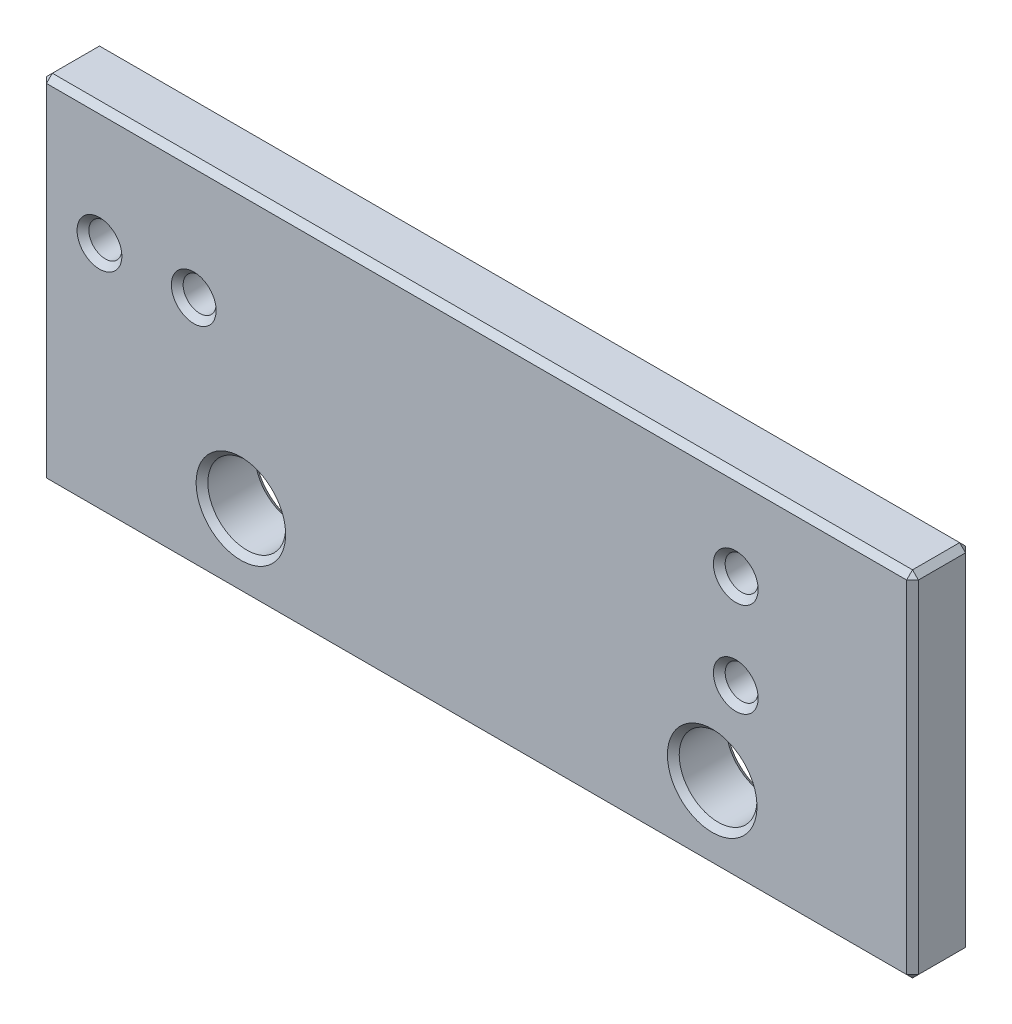
ISO-10303-21;
HEADER;
FILE_DESCRIPTION(('STEP AP214'),'2;1');
FILE_NAME('part.step','',(''),(''),'','','');
FILE_SCHEMA(('AUTOMOTIVE_DESIGN { 1 0 10303 214 1 1 1 1 }'));
ENDSEC;
DATA;
#1=APPLICATION_CONTEXT('core data for automotive mechanical design processes');
#2=APPLICATION_PROTOCOL_DEFINITION('international standard','automotive_design',2000,#1);
#3=PRODUCT_CONTEXT('',#1,'mechanical');
#4=PRODUCT('Part','Part','',(#3));
#5=PRODUCT_RELATED_PRODUCT_CATEGORY('part','',(#4));
#6=PRODUCT_DEFINITION_FORMATION('','',#4);
#7=PRODUCT_DEFINITION_CONTEXT('part definition',#1,'design');
#8=PRODUCT_DEFINITION('design','',#6,#7);
#9=PRODUCT_DEFINITION_SHAPE('','',#8);
#10=(LENGTH_UNIT() NAMED_UNIT(*) SI_UNIT(.MILLI.,.METRE.));
#11=(NAMED_UNIT(*) PLANE_ANGLE_UNIT() SI_UNIT($,.RADIAN.));
#12=(NAMED_UNIT(*) SI_UNIT($,.STERADIAN.) SOLID_ANGLE_UNIT());
#13=UNCERTAINTY_MEASURE_WITH_UNIT(LENGTH_MEASURE(1.E-05),#10,'distance_accuracy_value','');
#14=(GEOMETRIC_REPRESENTATION_CONTEXT(3) GLOBAL_UNCERTAINTY_ASSIGNED_CONTEXT((#13)) GLOBAL_UNIT_ASSIGNED_CONTEXT((#10,
#11,#12)) REPRESENTATION_CONTEXT('',''));
#15=CARTESIAN_POINT('',(0.,0.,0.));
#16=DIRECTION('',(0.,0.,1.));
#17=DIRECTION('',(1.,0.,0.));
#18=AXIS2_PLACEMENT_3D('',#15,#16,#17);
#19=CARTESIAN_POINT('',(0.,0.,5.));
#20=DIRECTION('',(1.,0.,0.));
#21=DIRECTION('',(0.,0.,-1.));
#22=AXIS2_PLACEMENT_3D('',#19,#20,#21);
#23=PLANE('',#22);
#24=DIRECTION('',(0.,0.,-1.));
#25=VECTOR('',#24,1.);
#26=CARTESIAN_POINT('',(0.,29.5,5.));
#27=LINE('',#26,#25);
#28=CARTESIAN_POINT('',(0.,29.5,4.5));
#29=VERTEX_POINT('',#28);
#30=CARTESIAN_POINT('',(0.,29.5,0.5));
#31=VERTEX_POINT('',#30);
#32=EDGE_CURVE('E42',#29,#31,#27,.T.);
#33=ORIENTED_EDGE('',*,*,#32,.T.);
#34=DIRECTION('',(0.,-1.,0.));
#35=VECTOR('',#34,1.);
#36=CARTESIAN_POINT('',(0.,0.,0.5));
#37=LINE('',#36,#35);
#38=CARTESIAN_POINT('',(0.,0.5,0.5));
#39=VERTEX_POINT('',#38);
#40=EDGE_CURVE('E11',#31,#39,#37,.T.);
#41=ORIENTED_EDGE('',*,*,#40,.T.);
#42=DIRECTION('',(0.,0.,1.));
#43=VECTOR('',#42,1.);
#44=CARTESIAN_POINT('',(0.,0.5,5.));
#45=LINE('',#44,#43);
#46=CARTESIAN_POINT('',(0.,0.5,4.5));
#47=VERTEX_POINT('',#46);
#48=EDGE_CURVE('E269',#39,#47,#45,.T.);
#49=ORIENTED_EDGE('',*,*,#48,.T.);
#50=DIRECTION('',(0.,1.,0.));
#51=VECTOR('',#50,1.);
#52=CARTESIAN_POINT('',(0.,0.,4.5));
#53=LINE('',#52,#51);
#54=EDGE_CURVE('E53',#47,#29,#53,.T.);
#55=ORIENTED_EDGE('',*,*,#54,.T.);
#56=EDGE_LOOP('',(#33,#41,#49,#55));
#57=FACE_BOUND('',#56,.T.);
#58=ADVANCED_FACE('F33',(#57),#23,.F.);
#59=CARTESIAN_POINT('',(0.,0.,5.));
#60=DIRECTION('',(0.,1.,0.));
#61=DIRECTION('',(0.,0.,1.));
#62=AXIS2_PLACEMENT_3D('',#59,#60,#61);
#63=PLANE('',#62);
#64=DIRECTION('',(0.,0.,-1.));
#65=VECTOR('',#64,1.);
#66=CARTESIAN_POINT('',(0.5,0.,5.));
#67=LINE('',#66,#65);
#68=CARTESIAN_POINT('',(0.5,0.,4.5));
#69=VERTEX_POINT('',#68);
#70=CARTESIAN_POINT('',(0.5,0.,0.5));
#71=VERTEX_POINT('',#70);
#72=EDGE_CURVE('E244',#69,#71,#67,.T.);
#73=ORIENTED_EDGE('',*,*,#72,.T.);
#74=DIRECTION('',(1.,0.,0.));
#75=VECTOR('',#74,1.);
#76=CARTESIAN_POINT('',(74.,0.,0.5));
#77=LINE('',#76,#75);
#78=CARTESIAN_POINT('',(73.5,0.,0.5));
#79=VERTEX_POINT('',#78);
#80=EDGE_CURVE('E130',#71,#79,#77,.T.);
#81=ORIENTED_EDGE('',*,*,#80,.T.);
#82=DIRECTION('',(0.,0.,1.));
#83=VECTOR('',#82,1.);
#84=CARTESIAN_POINT('',(73.5,0.,5.));
#85=LINE('',#84,#83);
#86=CARTESIAN_POINT('',(73.5,0.,4.5));
#87=VERTEX_POINT('',#86);
#88=EDGE_CURVE('E248',#79,#87,#85,.T.);
#89=ORIENTED_EDGE('',*,*,#88,.T.);
#90=DIRECTION('',(-1.,0.,0.));
#91=VECTOR('',#90,1.);
#92=CARTESIAN_POINT('',(0.,0.,4.5));
#93=LINE('',#92,#91);
#94=EDGE_CURVE('E246',#87,#69,#93,.T.);
#95=ORIENTED_EDGE('',*,*,#94,.T.);
#96=EDGE_LOOP('',(#73,#81,#89,#95));
#97=FACE_BOUND('',#96,.T.);
#98=ADVANCED_FACE('F353',(#97),#63,.F.);
#99=CARTESIAN_POINT('',(74.,0.,5.));
#100=DIRECTION('',(-1.,0.,0.));
#101=DIRECTION('',(0.,0.,1.));
#102=AXIS2_PLACEMENT_3D('',#99,#100,#101);
#103=PLANE('',#102);
#104=DIRECTION('',(0.,0.,-1.));
#105=VECTOR('',#104,1.);
#106=CARTESIAN_POINT('',(74.,0.5,5.));
#107=LINE('',#106,#105);
#108=CARTESIAN_POINT('',(74.,0.5,4.5));
#109=VERTEX_POINT('',#108);
#110=CARTESIAN_POINT('',(74.,0.5,0.5));
#111=VERTEX_POINT('',#110);
#112=EDGE_CURVE('E251',#109,#111,#107,.T.);
#113=ORIENTED_EDGE('',*,*,#112,.T.);
#114=DIRECTION('',(0.,1.,0.));
#115=VECTOR('',#114,1.);
#116=CARTESIAN_POINT('',(74.,30.,0.5));
#117=LINE('',#116,#115);
#118=CARTESIAN_POINT('',(74.,29.5,0.5));
#119=VERTEX_POINT('',#118);
#120=EDGE_CURVE('E257',#111,#119,#117,.T.);
#121=ORIENTED_EDGE('',*,*,#120,.T.);
#122=DIRECTION('',(0.,0.,1.));
#123=VECTOR('',#122,1.);
#124=CARTESIAN_POINT('',(74.,29.5,5.));
#125=LINE('',#124,#123);
#126=CARTESIAN_POINT('',(74.,29.5,4.5));
#127=VERTEX_POINT('',#126);
#128=EDGE_CURVE('E255',#119,#127,#125,.T.);
#129=ORIENTED_EDGE('',*,*,#128,.T.);
#130=DIRECTION('',(0.,-1.,0.));
#131=VECTOR('',#130,1.);
#132=CARTESIAN_POINT('',(74.,0.,4.5));
#133=LINE('',#132,#131);
#134=EDGE_CURVE('E253',#127,#109,#133,.T.);
#135=ORIENTED_EDGE('',*,*,#134,.T.);
#136=EDGE_LOOP('',(#113,#121,#129,#135));
#137=FACE_BOUND('',#136,.T.);
#138=ADVANCED_FACE('F407',(#137),#103,.F.);
#139=CARTESIAN_POINT('',(0.,30.,5.));
#140=DIRECTION('',(0.,-1.,0.));
#141=DIRECTION('',(0.,0.,-1.));
#142=AXIS2_PLACEMENT_3D('',#139,#140,#141);
#143=PLANE('',#142);
#144=DIRECTION('',(1.,0.,0.));
#145=VECTOR('',#144,1.);
#146=CARTESIAN_POINT('',(0.,30.,4.5));
#147=LINE('',#146,#145);
#148=CARTESIAN_POINT('',(0.5,30.,4.5));
#149=VERTEX_POINT('',#148);
#150=CARTESIAN_POINT('',(73.5,30.,4.5));
#151=VERTEX_POINT('',#150);
#152=EDGE_CURVE('E262',#149,#151,#147,.T.);
#153=ORIENTED_EDGE('',*,*,#152,.T.);
#154=DIRECTION('',(0.,0.,-1.));
#155=VECTOR('',#154,1.);
#156=CARTESIAN_POINT('',(73.5,30.,5.));
#157=LINE('',#156,#155);
#158=CARTESIAN_POINT('',(73.5,30.,0.5));
#159=VERTEX_POINT('',#158);
#160=EDGE_CURVE('E267',#151,#159,#157,.T.);
#161=ORIENTED_EDGE('',*,*,#160,.T.);
#162=DIRECTION('',(-1.,0.,0.));
#163=VECTOR('',#162,1.);
#164=CARTESIAN_POINT('',(0.,30.,0.5));
#165=LINE('',#164,#163);
#166=CARTESIAN_POINT('',(0.5,30.,0.5));
#167=VERTEX_POINT('',#166);
#168=EDGE_CURVE('E264',#159,#167,#165,.T.);
#169=ORIENTED_EDGE('',*,*,#168,.T.);
#170=DIRECTION('',(0.,0.,1.));
#171=VECTOR('',#170,1.);
#172=CARTESIAN_POINT('',(0.5,30.,5.));
#173=LINE('',#172,#171);
#174=EDGE_CURVE('E260',#167,#149,#173,.T.);
#175=ORIENTED_EDGE('',*,*,#174,.T.);
#176=EDGE_LOOP('',(#153,#161,#169,#175));
#177=FACE_BOUND('',#176,.T.);
#178=ADVANCED_FACE('F376',(#177),#143,.F.);
#179=CARTESIAN_POINT('',(0.,0.,5.));
#180=DIRECTION('',(0.,0.,-1.));
#181=DIRECTION('',(-1.,0.,0.));
#182=AXIS2_PLACEMENT_3D('',#179,#180,#181);
#183=PLANE('',#182);
#184=CARTESIAN_POINT('',(57.,6.5,5.));
#185=DIRECTION('',(0.,0.,-1.));
#186=DIRECTION('',(-1.,0.,0.));
#187=AXIS2_PLACEMENT_3D('',#184,#185,#186);
#188=CIRCLE('',#187,3.79999999999999);
#189=CARTESIAN_POINT('',(53.2,6.5,5.));
#190=VERTEX_POINT('',#189);
#191=EDGE_CURVE('E241',#190,#190,#188,.T.);
#192=ORIENTED_EDGE('',*,*,#191,.T.);
#193=EDGE_LOOP('',(#192));
#194=FACE_BOUND('',#193,.T.);
#195=CARTESIAN_POINT('',(17.,6.5,5.));
#196=DIRECTION('',(0.,0.,-1.));
#197=DIRECTION('',(-1.,0.,0.));
#198=AXIS2_PLACEMENT_3D('',#195,#196,#197);
#199=CIRCLE('',#198,3.79999999999999);
#200=CARTESIAN_POINT('',(13.2,6.5,5.));
#201=VERTEX_POINT('',#200);
#202=EDGE_CURVE('E238',#201,#201,#199,.T.);
#203=ORIENTED_EDGE('',*,*,#202,.T.);
#204=EDGE_LOOP('',(#203));
#205=FACE_BOUND('',#204,.T.);
#206=CARTESIAN_POINT('',(59.,14.5,5.));
#207=DIRECTION('',(0.,0.,-1.));
#208=DIRECTION('',(-1.,0.,0.));
#209=AXIS2_PLACEMENT_3D('',#206,#207,#208);
#210=CIRCLE('',#209,1.89999999999999);
#211=CARTESIAN_POINT('',(57.1,14.5,5.));
#212=VERTEX_POINT('',#211);
#213=EDGE_CURVE('E235',#212,#212,#210,.T.);
#214=ORIENTED_EDGE('',*,*,#213,.T.);
#215=EDGE_LOOP('',(#214));
#216=FACE_BOUND('',#215,.T.);
#217=CARTESIAN_POINT('',(59.,22.5,5.));
#218=DIRECTION('',(0.,0.,-1.));
#219=DIRECTION('',(-1.,0.,0.));
#220=AXIS2_PLACEMENT_3D('',#217,#218,#219);
#221=CIRCLE('',#220,1.89999999999999);
#222=CARTESIAN_POINT('',(57.1,22.5,5.));
#223=VERTEX_POINT('',#222);
#224=EDGE_CURVE('E232',#223,#223,#221,.T.);
#225=ORIENTED_EDGE('',*,*,#224,.T.);
#226=EDGE_LOOP('',(#225));
#227=FACE_BOUND('',#226,.T.);
#228=CARTESIAN_POINT('',(13.,20.,5.));
#229=DIRECTION('',(0.,0.,-1.));
#230=DIRECTION('',(-1.,0.,0.));
#231=AXIS2_PLACEMENT_3D('',#228,#229,#230);
#232=CIRCLE('',#231,1.89999999999999);
#233=CARTESIAN_POINT('',(11.1,20.,5.));
#234=VERTEX_POINT('',#233);
#235=EDGE_CURVE('E229',#234,#234,#232,.T.);
#236=ORIENTED_EDGE('',*,*,#235,.T.);
#237=EDGE_LOOP('',(#236));
#238=FACE_BOUND('',#237,.T.);
#239=CARTESIAN_POINT('',(5.,20.,5.));
#240=DIRECTION('',(0.,0.,-1.));
#241=DIRECTION('',(-1.,0.,0.));
#242=AXIS2_PLACEMENT_3D('',#239,#240,#241);
#243=CIRCLE('',#242,1.89999999999999);
#244=CARTESIAN_POINT('',(3.10000000000001,20.,5.));
#245=VERTEX_POINT('',#244);
#246=EDGE_CURVE('E226',#245,#245,#243,.T.);
#247=ORIENTED_EDGE('',*,*,#246,.T.);
#248=EDGE_LOOP('',(#247));
#249=FACE_BOUND('',#248,.T.);
#250=DIRECTION('',(0.,1.,0.));
#251=VECTOR('',#250,1.);
#252=CARTESIAN_POINT('',(73.5,0.,5.));
#253=LINE('',#252,#251);
#254=CARTESIAN_POINT('',(73.5,0.5,5.));
#255=VERTEX_POINT('',#254);
#256=CARTESIAN_POINT('',(73.5,29.5,5.));
#257=VERTEX_POINT('',#256);
#258=EDGE_CURVE('E221',#255,#257,#253,.T.);
#259=ORIENTED_EDGE('',*,*,#258,.T.);
#260=DIRECTION('',(-1.,0.,0.));
#261=VECTOR('',#260,1.);
#262=CARTESIAN_POINT('',(0.,29.5,5.));
#263=LINE('',#262,#261);
#264=CARTESIAN_POINT('',(0.5,29.5,5.));
#265=VERTEX_POINT('',#264);
#266=EDGE_CURVE('E223',#257,#265,#263,.T.);
#267=ORIENTED_EDGE('',*,*,#266,.T.);
#268=DIRECTION('',(0.,-1.,0.));
#269=VECTOR('',#268,1.);
#270=CARTESIAN_POINT('',(0.5,0.,5.));
#271=LINE('',#270,#269);
#272=CARTESIAN_POINT('',(0.5,0.5,5.));
#273=VERTEX_POINT('',#272);
#274=EDGE_CURVE('E217',#265,#273,#271,.T.);
#275=ORIENTED_EDGE('',*,*,#274,.T.);
#276=DIRECTION('',(1.,0.,0.));
#277=VECTOR('',#276,1.);
#278=CARTESIAN_POINT('',(0.,0.5,5.));
#279=LINE('',#278,#277);
#280=EDGE_CURVE('E219',#273,#255,#279,.T.);
#281=ORIENTED_EDGE('',*,*,#280,.T.);
#282=EDGE_LOOP('',(#259,#267,#275,#281));
#283=FACE_BOUND('',#282,.T.);
#284=ADVANCED_FACE('F362',(#194,#205,#216,#227,#238,#249,#283),#183,.F.);
#285=CARTESIAN_POINT('',(0.,0.,0.));
#286=DIRECTION('',(0.,0.,-1.));
#287=DIRECTION('',(-1.,0.,0.));
#288=AXIS2_PLACEMENT_3D('',#285,#286,#287);
#289=PLANE('',#288);
#290=CARTESIAN_POINT('',(57.,6.5,0.));
#291=DIRECTION('',(0.,0.,-1.));
#292=DIRECTION('',(-1.,0.,0.));
#293=AXIS2_PLACEMENT_3D('',#290,#291,#292);
#294=CIRCLE('',#293,3.79999999999998);
#295=CARTESIAN_POINT('',(53.2,6.5,0.));
#296=VERTEX_POINT('',#295);
#297=EDGE_CURVE('E178',#296,#296,#294,.F.);
#298=ORIENTED_EDGE('',*,*,#297,.T.);
#299=EDGE_LOOP('',(#298));
#300=FACE_BOUND('',#299,.T.);
#301=CARTESIAN_POINT('',(17.,6.5,0.));
#302=DIRECTION('',(0.,0.,-1.));
#303=DIRECTION('',(-1.,0.,0.));
#304=AXIS2_PLACEMENT_3D('',#301,#302,#303);
#305=CIRCLE('',#304,3.8);
#306=CARTESIAN_POINT('',(13.2,6.5,0.));
#307=VERTEX_POINT('',#306);
#308=EDGE_CURVE('E175',#307,#307,#305,.F.);
#309=ORIENTED_EDGE('',*,*,#308,.T.);
#310=EDGE_LOOP('',(#309));
#311=FACE_BOUND('',#310,.T.);
#312=CARTESIAN_POINT('',(59.,14.5,0.));
#313=DIRECTION('',(0.,0.,-1.));
#314=DIRECTION('',(-1.,0.,0.));
#315=AXIS2_PLACEMENT_3D('',#312,#313,#314);
#316=CIRCLE('',#315,1.90000000000002);
#317=CARTESIAN_POINT('',(57.1,14.5,0.));
#318=VERTEX_POINT('',#317);
#319=EDGE_CURVE('E172',#318,#318,#316,.F.);
#320=ORIENTED_EDGE('',*,*,#319,.T.);
#321=EDGE_LOOP('',(#320));
#322=FACE_BOUND('',#321,.T.);
#323=CARTESIAN_POINT('',(59.,22.5,0.));
#324=DIRECTION('',(0.,0.,-1.));
#325=DIRECTION('',(-1.,0.,0.));
#326=AXIS2_PLACEMENT_3D('',#323,#324,#325);
#327=CIRCLE('',#326,1.90000000000002);
#328=CARTESIAN_POINT('',(57.1,22.5,0.));
#329=VERTEX_POINT('',#328);
#330=EDGE_CURVE('E169',#329,#329,#327,.F.);
#331=ORIENTED_EDGE('',*,*,#330,.T.);
#332=EDGE_LOOP('',(#331));
#333=FACE_BOUND('',#332,.T.);
#334=CARTESIAN_POINT('',(13.,20.,0.));
#335=DIRECTION('',(0.,0.,-1.));
#336=DIRECTION('',(-1.,0.,0.));
#337=AXIS2_PLACEMENT_3D('',#334,#335,#336);
#338=CIRCLE('',#337,1.89999999999999);
#339=CARTESIAN_POINT('',(11.1,20.,0.));
#340=VERTEX_POINT('',#339);
#341=EDGE_CURVE('E162',#340,#340,#338,.F.);
#342=ORIENTED_EDGE('',*,*,#341,.T.);
#343=EDGE_LOOP('',(#342));
#344=FACE_BOUND('',#343,.T.);
#345=CARTESIAN_POINT('',(5.,20.,0.));
#346=DIRECTION('',(0.,0.,-1.));
#347=DIRECTION('',(-1.,0.,0.));
#348=AXIS2_PLACEMENT_3D('',#345,#346,#347);
#349=CIRCLE('',#348,1.89999999999999);
#350=CARTESIAN_POINT('',(3.10000000000002,20.,0.));
#351=VERTEX_POINT('',#350);
#352=EDGE_CURVE('E159',#351,#351,#349,.F.);
#353=ORIENTED_EDGE('',*,*,#352,.T.);
#354=EDGE_LOOP('',(#353));
#355=FACE_BOUND('',#354,.T.);
#356=DIRECTION('',(0.,-1.,0.));
#357=VECTOR('',#356,1.);
#358=CARTESIAN_POINT('',(73.5,0.,0.));
#359=LINE('',#358,#357);
#360=CARTESIAN_POINT('',(73.5,29.5,0.));
#361=VERTEX_POINT('',#360);
#362=CARTESIAN_POINT('',(73.5,0.5,0.));
#363=VERTEX_POINT('',#362);
#364=EDGE_CURVE('E157',#361,#363,#359,.T.);
#365=ORIENTED_EDGE('',*,*,#364,.T.);
#366=DIRECTION('',(-1.,0.,0.));
#367=VECTOR('',#366,1.);
#368=CARTESIAN_POINT('',(0.,0.5,0.));
#369=LINE('',#368,#367);
#370=CARTESIAN_POINT('',(0.5,0.5,0.));
#371=VERTEX_POINT('',#370);
#372=EDGE_CURVE('E127',#363,#371,#369,.T.);
#373=ORIENTED_EDGE('',*,*,#372,.T.);
#374=DIRECTION('',(0.,1.,0.));
#375=VECTOR('',#374,1.);
#376=CARTESIAN_POINT('',(0.5,30.,0.));
#377=LINE('',#376,#375);
#378=CARTESIAN_POINT('',(0.5,29.5,0.));
#379=VERTEX_POINT('',#378);
#380=EDGE_CURVE('E147',#371,#379,#377,.T.);
#381=ORIENTED_EDGE('',*,*,#380,.T.);
#382=DIRECTION('',(1.,0.,0.));
#383=VECTOR('',#382,1.);
#384=CARTESIAN_POINT('',(74.,29.5,0.));
#385=LINE('',#384,#383);
#386=EDGE_CURVE('E153',#379,#361,#385,.T.);
#387=ORIENTED_EDGE('',*,*,#386,.T.);
#388=EDGE_LOOP('',(#365,#373,#381,#387));
#389=FACE_BOUND('',#388,.T.);
#390=ADVANCED_FACE('F155',(#300,#311,#322,#333,#344,#355,#389),#289,.T.);
#391=CARTESIAN_POINT('',(57.,6.5,5.));
#392=DIRECTION('',(0.,0.,1.));
#393=DIRECTION('',(1.,0.,0.));
#394=AXIS2_PLACEMENT_3D('',#391,#392,#393);
#395=CYLINDRICAL_SURFACE('',#394,3.3);
#396=CARTESIAN_POINT('',(57.,6.5,0.499999999999991));
#397=DIRECTION('',(0.,0.,-1.));
#398=DIRECTION('',(-1.,0.,0.));
#399=AXIS2_PLACEMENT_3D('',#396,#397,#398);
#400=CIRCLE('',#399,3.3);
#401=CARTESIAN_POINT('',(53.7,6.5,0.499999999999991));
#402=VERTEX_POINT('',#401);
#403=EDGE_CURVE('E184',#402,#402,#400,.T.);
#404=ORIENTED_EDGE('',*,*,#403,.T.);
#405=EDGE_LOOP('',(#404));
#406=FACE_BOUND('',#405,.T.);
#407=CARTESIAN_POINT('',(57.,6.5,4.50000000000001));
#408=DIRECTION('',(0.,0.,-1.));
#409=DIRECTION('',(-1.,0.,0.));
#410=AXIS2_PLACEMENT_3D('',#407,#408,#409);
#411=CIRCLE('',#410,3.3);
#412=CARTESIAN_POINT('',(53.7,6.5,4.50000000000001));
#413=VERTEX_POINT('',#412);
#414=EDGE_CURVE('E181',#413,#413,#411,.F.);
#415=ORIENTED_EDGE('',*,*,#414,.T.);
#416=EDGE_LOOP('',(#415));
#417=FACE_BOUND('',#416,.T.);
#418=ADVANCED_FACE('F700',(#406,#417),#395,.F.);
#419=CARTESIAN_POINT('',(17.,6.5,5.));
#420=DIRECTION('',(0.,0.,1.));
#421=DIRECTION('',(1.,0.,0.));
#422=AXIS2_PLACEMENT_3D('',#419,#420,#421);
#423=CYLINDRICAL_SURFACE('',#422,3.3);
#424=CARTESIAN_POINT('',(17.,6.5,0.50000000000001));
#425=DIRECTION('',(0.,0.,-1.));
#426=DIRECTION('',(-1.,0.,0.));
#427=AXIS2_PLACEMENT_3D('',#424,#425,#426);
#428=CIRCLE('',#427,3.3);
#429=CARTESIAN_POINT('',(13.7,6.5,0.50000000000001));
#430=VERTEX_POINT('',#429);
#431=EDGE_CURVE('E190',#430,#430,#428,.T.);
#432=ORIENTED_EDGE('',*,*,#431,.T.);
#433=EDGE_LOOP('',(#432));
#434=FACE_BOUND('',#433,.T.);
#435=CARTESIAN_POINT('',(17.,6.5,4.50000000000001));
#436=DIRECTION('',(0.,0.,-1.));
#437=DIRECTION('',(-1.,0.,0.));
#438=AXIS2_PLACEMENT_3D('',#435,#436,#437);
#439=CIRCLE('',#438,3.3);
#440=CARTESIAN_POINT('',(13.7,6.5,4.50000000000001));
#441=VERTEX_POINT('',#440);
#442=EDGE_CURVE('E187',#441,#441,#439,.F.);
#443=ORIENTED_EDGE('',*,*,#442,.T.);
#444=EDGE_LOOP('',(#443));
#445=FACE_BOUND('',#444,.T.);
#446=ADVANCED_FACE('F691',(#434,#445),#423,.F.);
#447=CARTESIAN_POINT('',(59.,14.5,0.));
#448=DIRECTION('',(0.,0.,1.));
#449=DIRECTION('',(1.,0.,0.));
#450=AXIS2_PLACEMENT_3D('',#447,#448,#449);
#451=CYLINDRICAL_SURFACE('',#450,1.4);
#452=CARTESIAN_POINT('',(59.,14.5,0.500000000000021));
#453=DIRECTION('',(0.,0.,-1.));
#454=DIRECTION('',(-1.,0.,0.));
#455=AXIS2_PLACEMENT_3D('',#452,#453,#454);
#456=CIRCLE('',#455,1.4);
#457=CARTESIAN_POINT('',(57.6,14.5,0.500000000000021));
#458=VERTEX_POINT('',#457);
#459=EDGE_CURVE('E196',#458,#458,#456,.T.);
#460=ORIENTED_EDGE('',*,*,#459,.T.);
#461=EDGE_LOOP('',(#460));
#462=FACE_BOUND('',#461,.T.);
#463=CARTESIAN_POINT('',(59.,14.5,4.50000000000001));
#464=DIRECTION('',(0.,0.,-1.));
#465=DIRECTION('',(-1.,0.,0.));
#466=AXIS2_PLACEMENT_3D('',#463,#464,#465);
#467=CIRCLE('',#466,1.4);
#468=CARTESIAN_POINT('',(57.6,14.5,4.50000000000001));
#469=VERTEX_POINT('',#468);
#470=EDGE_CURVE('E193',#469,#469,#467,.F.);
#471=ORIENTED_EDGE('',*,*,#470,.T.);
#472=EDGE_LOOP('',(#471));
#473=FACE_BOUND('',#472,.T.);
#474=ADVANCED_FACE('F682',(#462,#473),#451,.F.);
#475=CARTESIAN_POINT('',(59.,22.5,0.));
#476=DIRECTION('',(0.,0.,1.));
#477=DIRECTION('',(1.,0.,0.));
#478=AXIS2_PLACEMENT_3D('',#475,#476,#477);
#479=CYLINDRICAL_SURFACE('',#478,1.4);
#480=CARTESIAN_POINT('',(59.,22.5,0.500000000000022));
#481=DIRECTION('',(0.,0.,-1.));
#482=DIRECTION('',(-1.,0.,0.));
#483=AXIS2_PLACEMENT_3D('',#480,#481,#482);
#484=CIRCLE('',#483,1.4);
#485=CARTESIAN_POINT('',(57.6,22.5,0.500000000000022));
#486=VERTEX_POINT('',#485);
#487=EDGE_CURVE('E202',#486,#486,#484,.T.);
#488=ORIENTED_EDGE('',*,*,#487,.T.);
#489=EDGE_LOOP('',(#488));
#490=FACE_BOUND('',#489,.T.);
#491=CARTESIAN_POINT('',(59.,22.5,4.50000000000001));
#492=DIRECTION('',(0.,0.,-1.));
#493=DIRECTION('',(-1.,0.,0.));
#494=AXIS2_PLACEMENT_3D('',#491,#492,#493);
#495=CIRCLE('',#494,1.4);
#496=CARTESIAN_POINT('',(57.6,22.5,4.50000000000001));
#497=VERTEX_POINT('',#496);
#498=EDGE_CURVE('E199',#497,#497,#495,.F.);
#499=ORIENTED_EDGE('',*,*,#498,.T.);
#500=EDGE_LOOP('',(#499));
#501=FACE_BOUND('',#500,.T.);
#502=ADVANCED_FACE('F673',(#490,#501),#479,.F.);
#503=CARTESIAN_POINT('',(13.,20.,0.));
#504=DIRECTION('',(0.,0.,1.));
#505=DIRECTION('',(1.,0.,0.));
#506=AXIS2_PLACEMENT_3D('',#503,#504,#505);
#507=CYLINDRICAL_SURFACE('',#506,1.4);
#508=CARTESIAN_POINT('',(13.,20.,0.499999999999981));
#509=DIRECTION('',(0.,0.,-1.));
#510=DIRECTION('',(-1.,0.,0.));
#511=AXIS2_PLACEMENT_3D('',#508,#509,#510);
#512=CIRCLE('',#511,1.4);
#513=CARTESIAN_POINT('',(11.6,20.,0.499999999999981));
#514=VERTEX_POINT('',#513);
#515=EDGE_CURVE('E208',#514,#514,#512,.T.);
#516=ORIENTED_EDGE('',*,*,#515,.T.);
#517=EDGE_LOOP('',(#516));
#518=FACE_BOUND('',#517,.T.);
#519=CARTESIAN_POINT('',(13.,20.,4.50000000000001));
#520=DIRECTION('',(0.,0.,-1.));
#521=DIRECTION('',(-1.,0.,0.));
#522=AXIS2_PLACEMENT_3D('',#519,#520,#521);
#523=CIRCLE('',#522,1.4);
#524=CARTESIAN_POINT('',(11.6,20.,4.50000000000001));
#525=VERTEX_POINT('',#524);
#526=EDGE_CURVE('E205',#525,#525,#523,.F.);
#527=ORIENTED_EDGE('',*,*,#526,.T.);
#528=EDGE_LOOP('',(#527));
#529=FACE_BOUND('',#528,.T.);
#530=ADVANCED_FACE('F664',(#518,#529),#507,.F.);
#531=CARTESIAN_POINT('',(5.,20.,0.));
#532=DIRECTION('',(0.,0.,1.));
#533=DIRECTION('',(1.,0.,0.));
#534=AXIS2_PLACEMENT_3D('',#531,#532,#533);
#535=CYLINDRICAL_SURFACE('',#534,1.4);
#536=CARTESIAN_POINT('',(5.,20.,0.499999999999981));
#537=DIRECTION('',(0.,0.,-1.));
#538=DIRECTION('',(-1.,0.,0.));
#539=AXIS2_PLACEMENT_3D('',#536,#537,#538);
#540=CIRCLE('',#539,1.4);
#541=CARTESIAN_POINT('',(3.6,20.,0.499999999999981));
#542=VERTEX_POINT('',#541);
#543=EDGE_CURVE('E214',#542,#542,#540,.T.);
#544=ORIENTED_EDGE('',*,*,#543,.T.);
#545=EDGE_LOOP('',(#544));
#546=FACE_BOUND('',#545,.T.);
#547=CARTESIAN_POINT('',(5.,20.,4.50000000000001));
#548=DIRECTION('',(0.,0.,-1.));
#549=DIRECTION('',(-1.,0.,0.));
#550=AXIS2_PLACEMENT_3D('',#547,#548,#549);
#551=CIRCLE('',#550,1.4);
#552=CARTESIAN_POINT('',(3.6,20.,4.50000000000001));
#553=VERTEX_POINT('',#552);
#554=EDGE_CURVE('E211',#553,#553,#551,.F.);
#555=ORIENTED_EDGE('',*,*,#554,.T.);
#556=EDGE_LOOP('',(#555));
#557=FACE_BOUND('',#556,.T.);
#558=ADVANCED_FACE('F415',(#546,#557),#535,.F.);
#559=CARTESIAN_POINT('',(57.,6.5,0.));
#560=DIRECTION('',(0.,0.,-1.));
#561=DIRECTION('',(-1.,0.,0.));
#562=AXIS2_PLACEMENT_3D('',#559,#560,#561);
#563=CONICAL_SURFACE('',#562,3.79999999999998,0.785398163397444);
#564=ORIENTED_EDGE('',*,*,#403,.F.);
#565=EDGE_LOOP('',(#564));
#566=FACE_BOUND('',#565,.T.);
#567=ORIENTED_EDGE('',*,*,#297,.F.);
#568=EDGE_LOOP('',(#567));
#569=FACE_BOUND('',#568,.T.);
#570=ADVANCED_FACE('F411',(#566,#569),#563,.F.);
#571=CARTESIAN_POINT('',(17.,6.5,0.));
#572=DIRECTION('',(0.,0.,-1.));
#573=DIRECTION('',(-1.,0.,0.));
#574=AXIS2_PLACEMENT_3D('',#571,#572,#573);
#575=CONICAL_SURFACE('',#574,3.8,0.785398163397446);
#576=ORIENTED_EDGE('',*,*,#431,.F.);
#577=EDGE_LOOP('',(#576));
#578=FACE_BOUND('',#577,.T.);
#579=ORIENTED_EDGE('',*,*,#308,.F.);
#580=EDGE_LOOP('',(#579));
#581=FACE_BOUND('',#580,.T.);
#582=ADVANCED_FACE('F414',(#578,#581),#575,.F.);
#583=CARTESIAN_POINT('',(59.,14.5,0.));
#584=DIRECTION('',(0.,0.,-1.));
#585=DIRECTION('',(-1.,0.,0.));
#586=AXIS2_PLACEMENT_3D('',#583,#584,#585);
#587=CONICAL_SURFACE('',#586,1.90000000000002,0.78539816339745);
#588=ORIENTED_EDGE('',*,*,#459,.F.);
#589=EDGE_LOOP('',(#588));
#590=FACE_BOUND('',#589,.T.);
#591=ORIENTED_EDGE('',*,*,#319,.F.);
#592=EDGE_LOOP('',(#591));
#593=FACE_BOUND('',#592,.T.);
#594=ADVANCED_FACE('F419',(#590,#593),#587,.F.);
#595=CARTESIAN_POINT('',(59.,22.5,0.));
#596=DIRECTION('',(0.,0.,-1.));
#597=DIRECTION('',(-1.,0.,0.));
#598=AXIS2_PLACEMENT_3D('',#595,#596,#597);
#599=CONICAL_SURFACE('',#598,1.90000000000002,0.78539816339745);
#600=ORIENTED_EDGE('',*,*,#487,.F.);
#601=EDGE_LOOP('',(#600));
#602=FACE_BOUND('',#601,.T.);
#603=ORIENTED_EDGE('',*,*,#330,.F.);
#604=EDGE_LOOP('',(#603));
#605=FACE_BOUND('',#604,.T.);
#606=ADVANCED_FACE('F423',(#602,#605),#599,.F.);
#607=CARTESIAN_POINT('',(13.,20.,0.));
#608=DIRECTION('',(0.,0.,-1.));
#609=DIRECTION('',(-1.,0.,0.));
#610=AXIS2_PLACEMENT_3D('',#607,#608,#609);
#611=CONICAL_SURFACE('',#610,1.89999999999999,0.785398163397453);
#612=ORIENTED_EDGE('',*,*,#515,.F.);
#613=EDGE_LOOP('',(#612));
#614=FACE_BOUND('',#613,.T.);
#615=ORIENTED_EDGE('',*,*,#341,.F.);
#616=EDGE_LOOP('',(#615));
#617=FACE_BOUND('',#616,.T.);
#618=ADVANCED_FACE('F427',(#614,#617),#611,.F.);
#619=CARTESIAN_POINT('',(5.,20.,0.));
#620=DIRECTION('',(0.,0.,-1.));
#621=DIRECTION('',(-1.,0.,0.));
#622=AXIS2_PLACEMENT_3D('',#619,#620,#621);
#623=CONICAL_SURFACE('',#622,1.89999999999999,0.785398163397453);
#624=ORIENTED_EDGE('',*,*,#543,.F.);
#625=EDGE_LOOP('',(#624));
#626=FACE_BOUND('',#625,.T.);
#627=ORIENTED_EDGE('',*,*,#352,.F.);
#628=EDGE_LOOP('',(#627));
#629=FACE_BOUND('',#628,.T.);
#630=ADVANCED_FACE('F431',(#626,#629),#623,.F.);
#631=CARTESIAN_POINT('',(57.,6.5,4.50000000000001));
#632=DIRECTION('',(0.,0.,1.));
#633=DIRECTION('',(1.,0.,0.));
#634=AXIS2_PLACEMENT_3D('',#631,#632,#633);
#635=CONICAL_SURFACE('',#634,3.3,0.785398163397451);
#636=ORIENTED_EDGE('',*,*,#191,.F.);
#637=EDGE_LOOP('',(#636));
#638=FACE_BOUND('',#637,.T.);
#639=ORIENTED_EDGE('',*,*,#414,.F.);
#640=EDGE_LOOP('',(#639));
#641=FACE_BOUND('',#640,.T.);
#642=ADVANCED_FACE('F435',(#638,#641),#635,.F.);
#643=CARTESIAN_POINT('',(17.,6.5,4.50000000000001));
#644=DIRECTION('',(0.,0.,1.));
#645=DIRECTION('',(1.,0.,0.));
#646=AXIS2_PLACEMENT_3D('',#643,#644,#645);
#647=CONICAL_SURFACE('',#646,3.3,0.785398163397451);
#648=ORIENTED_EDGE('',*,*,#202,.F.);
#649=EDGE_LOOP('',(#648));
#650=FACE_BOUND('',#649,.T.);
#651=ORIENTED_EDGE('',*,*,#442,.F.);
#652=EDGE_LOOP('',(#651));
#653=FACE_BOUND('',#652,.T.);
#654=ADVANCED_FACE('F439',(#650,#653),#647,.F.);
#655=CARTESIAN_POINT('',(59.,14.5,4.50000000000001));
#656=DIRECTION('',(0.,0.,1.));
#657=DIRECTION('',(1.,0.,0.));
#658=AXIS2_PLACEMENT_3D('',#655,#656,#657);
#659=CONICAL_SURFACE('',#658,1.4,0.785398163397451);
#660=ORIENTED_EDGE('',*,*,#213,.F.);
#661=EDGE_LOOP('',(#660));
#662=FACE_BOUND('',#661,.T.);
#663=ORIENTED_EDGE('',*,*,#470,.F.);
#664=EDGE_LOOP('',(#663));
#665=FACE_BOUND('',#664,.T.);
#666=ADVANCED_FACE('F443',(#662,#665),#659,.F.);
#667=CARTESIAN_POINT('',(59.,22.5,4.50000000000001));
#668=DIRECTION('',(0.,0.,1.));
#669=DIRECTION('',(1.,0.,0.));
#670=AXIS2_PLACEMENT_3D('',#667,#668,#669);
#671=CONICAL_SURFACE('',#670,1.4,0.78539816339745);
#672=ORIENTED_EDGE('',*,*,#224,.F.);
#673=EDGE_LOOP('',(#672));
#674=FACE_BOUND('',#673,.T.);
#675=ORIENTED_EDGE('',*,*,#498,.F.);
#676=EDGE_LOOP('',(#675));
#677=FACE_BOUND('',#676,.T.);
#678=ADVANCED_FACE('F447',(#674,#677),#671,.F.);
#679=CARTESIAN_POINT('',(13.,20.,4.50000000000001));
#680=DIRECTION('',(0.,0.,1.));
#681=DIRECTION('',(1.,0.,0.));
#682=AXIS2_PLACEMENT_3D('',#679,#680,#681);
#683=CONICAL_SURFACE('',#682,1.4,0.78539816339745);
#684=ORIENTED_EDGE('',*,*,#235,.F.);
#685=EDGE_LOOP('',(#684));
#686=FACE_BOUND('',#685,.T.);
#687=ORIENTED_EDGE('',*,*,#526,.F.);
#688=EDGE_LOOP('',(#687));
#689=FACE_BOUND('',#688,.T.);
#690=ADVANCED_FACE('F451',(#686,#689),#683,.F.);
#691=CARTESIAN_POINT('',(5.,20.,4.50000000000001));
#692=DIRECTION('',(0.,0.,1.));
#693=DIRECTION('',(1.,0.,0.));
#694=AXIS2_PLACEMENT_3D('',#691,#692,#693);
#695=CONICAL_SURFACE('',#694,1.4,0.785398163397451);
#696=ORIENTED_EDGE('',*,*,#246,.F.);
#697=EDGE_LOOP('',(#696));
#698=FACE_BOUND('',#697,.T.);
#699=ORIENTED_EDGE('',*,*,#554,.F.);
#700=EDGE_LOOP('',(#699));
#701=FACE_BOUND('',#700,.T.);
#702=ADVANCED_FACE('F455',(#698,#701),#695,.F.);
#703=CARTESIAN_POINT('',(0.,29.5,5.));
#704=DIRECTION('',(0.,-0.707106781186547,-0.707106781186547));
#705=DIRECTION('',(-1.,0.,0.));
#706=AXIS2_PLACEMENT_3D('',#703,#704,#705);
#707=PLANE('',#706);
#708=DIRECTION('',(0.,-0.707106781186547,0.707106781186547));
#709=VECTOR('',#708,1.);
#710=CARTESIAN_POINT('',(0.5,29.5,5.));
#711=LINE('',#710,#709);
#712=EDGE_CURVE('E37',#265,#149,#711,.F.);
#713=ORIENTED_EDGE('',*,*,#712,.F.);
#714=ORIENTED_EDGE('',*,*,#266,.F.);
#715=DIRECTION('',(0.,0.707106781186547,-0.707106781186547));
#716=VECTOR('',#715,1.);
#717=CARTESIAN_POINT('',(73.5,30.,4.5));
#718=LINE('',#717,#716);
#719=EDGE_CURVE('E321',#151,#257,#718,.F.);
#720=ORIENTED_EDGE('',*,*,#719,.F.);
#721=ORIENTED_EDGE('',*,*,#152,.F.);
#722=EDGE_LOOP('',(#713,#714,#720,#721));
#723=FACE_BOUND('',#722,.T.);
#724=ADVANCED_FACE('F35',(#723),#707,.F.);
#725=CARTESIAN_POINT('',(0.5,29.5,5.));
#726=DIRECTION('',(-0.577350269189626,0.577350269189626,0.577350269189626));
#727=DIRECTION('',(0.707106781186547,0.,0.707106781186547));
#728=AXIS2_PLACEMENT_3D('',#725,#726,#727);
#729=PLANE('',#728);
#730=DIRECTION('',(-0.707106781186547,0.,-0.707106781186547));
#731=VECTOR('',#730,1.);
#732=CARTESIAN_POINT('',(0.5,29.5,5.));
#733=LINE('',#732,#731);
#734=EDGE_CURVE('E317',#265,#29,#733,.T.);
#735=ORIENTED_EDGE('',*,*,#734,.F.);
#736=ORIENTED_EDGE('',*,*,#712,.T.);
#737=DIRECTION('',(0.707106781186547,0.707106781186547,0.));
#738=VECTOR('',#737,1.);
#739=CARTESIAN_POINT('',(0.25,29.75,4.5));
#740=LINE('',#739,#738);
#741=EDGE_CURVE('E319',#29,#149,#740,.T.);
#742=ORIENTED_EDGE('',*,*,#741,.F.);
#743=EDGE_LOOP('',(#735,#736,#742));
#744=FACE_BOUND('',#743,.T.);
#745=ADVANCED_FACE('F332',(#744),#729,.T.);
#746=CARTESIAN_POINT('',(73.5,30.,4.5));
#747=DIRECTION('',(0.577350269189626,0.577350269189626,0.577350269189626));
#748=DIRECTION('',(0.707106781186547,0.,-0.707106781186547));
#749=AXIS2_PLACEMENT_3D('',#746,#747,#748);
#750=PLANE('',#749);
#751=DIRECTION('',(0.707106781186547,-0.707106781186547,0.));
#752=VECTOR('',#751,1.);
#753=CARTESIAN_POINT('',(73.5,30.,4.5));
#754=LINE('',#753,#752);
#755=EDGE_CURVE('E311',#151,#127,#754,.T.);
#756=ORIENTED_EDGE('',*,*,#755,.F.);
#757=ORIENTED_EDGE('',*,*,#719,.T.);
#758=DIRECTION('',(-0.707106781186547,0.,0.707106781186547));
#759=VECTOR('',#758,1.);
#760=CARTESIAN_POINT('',(73.75,29.5,4.75));
#761=LINE('',#760,#759);
#762=EDGE_CURVE('E314',#127,#257,#761,.T.);
#763=ORIENTED_EDGE('',*,*,#762,.F.);
#764=EDGE_LOOP('',(#756,#757,#763));
#765=FACE_BOUND('',#764,.T.);
#766=ADVANCED_FACE('F368',(#765),#750,.T.);
#767=CARTESIAN_POINT('',(0.,29.5,5.));
#768=DIRECTION('',(0.707106781186547,-0.707106781186547,0.));
#769=DIRECTION('',(0.,0.,-1.));
#770=AXIS2_PLACEMENT_3D('',#767,#768,#769);
#771=PLANE('',#770);
#772=ORIENTED_EDGE('',*,*,#741,.T.);
#773=ORIENTED_EDGE('',*,*,#174,.F.);
#774=DIRECTION('',(-0.707106781186547,-0.707106781186547,0.));
#775=VECTOR('',#774,1.);
#776=CARTESIAN_POINT('',(0.5,30.,0.5));
#777=LINE('',#776,#775);
#778=EDGE_CURVE('E306',#31,#167,#777,.F.);
#779=ORIENTED_EDGE('',*,*,#778,.F.);
#780=ORIENTED_EDGE('',*,*,#32,.F.);
#781=EDGE_LOOP('',(#772,#773,#779,#780));
#782=FACE_BOUND('',#781,.T.);
#783=ADVANCED_FACE('F338',(#782),#771,.F.);
#784=CARTESIAN_POINT('',(0.5,0.,5.));
#785=DIRECTION('',(0.707106781186547,0.,-0.707106781186547));
#786=DIRECTION('',(0.,-1.,0.));
#787=AXIS2_PLACEMENT_3D('',#784,#785,#786);
#788=PLANE('',#787);
#789=ORIENTED_EDGE('',*,*,#734,.T.);
#790=ORIENTED_EDGE('',*,*,#54,.F.);
#791=DIRECTION('',(0.707106781186547,0.,0.707106781186547));
#792=VECTOR('',#791,1.);
#793=CARTESIAN_POINT('',(0.25,0.5,4.75));
#794=LINE('',#793,#792);
#795=EDGE_CURVE('E303',#273,#47,#794,.F.);
#796=ORIENTED_EDGE('',*,*,#795,.F.);
#797=ORIENTED_EDGE('',*,*,#274,.F.);
#798=EDGE_LOOP('',(#789,#790,#796,#797));
#799=FACE_BOUND('',#798,.T.);
#800=ADVANCED_FACE('F345',(#799),#788,.F.);
#801=CARTESIAN_POINT('',(0.,0.5,5.));
#802=DIRECTION('',(0.,0.707106781186547,-0.707106781186547));
#803=DIRECTION('',(1.,0.,0.));
#804=AXIS2_PLACEMENT_3D('',#801,#802,#803);
#805=PLANE('',#804);
#806=DIRECTION('',(0.,0.707106781186547,0.707106781186547));
#807=VECTOR('',#806,1.);
#808=CARTESIAN_POINT('',(73.5,0.25,4.75));
#809=LINE('',#808,#807);
#810=EDGE_CURVE('E297',#255,#87,#809,.F.);
#811=ORIENTED_EDGE('',*,*,#810,.F.);
#812=ORIENTED_EDGE('',*,*,#280,.F.);
#813=DIRECTION('',(0.,-0.707106781186547,-0.707106781186547));
#814=VECTOR('',#813,1.);
#815=CARTESIAN_POINT('',(0.5,0.,4.5));
#816=LINE('',#815,#814);
#817=EDGE_CURVE('E300',#69,#273,#816,.F.);
#818=ORIENTED_EDGE('',*,*,#817,.F.);
#819=ORIENTED_EDGE('',*,*,#94,.F.);
#820=EDGE_LOOP('',(#811,#812,#818,#819));
#821=FACE_BOUND('',#820,.T.);
#822=ADVANCED_FACE('F359',(#821),#805,.F.);
#823=CARTESIAN_POINT('',(73.5,0.,5.));
#824=DIRECTION('',(-0.707106781186547,0.,-0.707106781186547));
#825=DIRECTION('',(0.,1.,0.));
#826=AXIS2_PLACEMENT_3D('',#823,#824,#825);
#827=PLANE('',#826);
#828=ORIENTED_EDGE('',*,*,#762,.T.);
#829=ORIENTED_EDGE('',*,*,#258,.F.);
#830=DIRECTION('',(0.707106781186547,0.,-0.707106781186547));
#831=VECTOR('',#830,1.);
#832=CARTESIAN_POINT('',(74.,0.5,4.5));
#833=LINE('',#832,#831);
#834=EDGE_CURVE('E294',#109,#255,#833,.F.);
#835=ORIENTED_EDGE('',*,*,#834,.F.);
#836=ORIENTED_EDGE('',*,*,#134,.F.);
#837=EDGE_LOOP('',(#828,#829,#835,#836));
#838=FACE_BOUND('',#837,.T.);
#839=ADVANCED_FACE('F365',(#838),#827,.F.);
#840=CARTESIAN_POINT('',(73.5,30.,5.));
#841=DIRECTION('',(-0.707106781186547,-0.707106781186547,0.));
#842=DIRECTION('',(0.,0.,-1.));
#843=AXIS2_PLACEMENT_3D('',#840,#841,#842);
#844=PLANE('',#843);
#845=ORIENTED_EDGE('',*,*,#755,.T.);
#846=ORIENTED_EDGE('',*,*,#128,.F.);
#847=DIRECTION('',(-0.707106781186547,0.707106781186547,0.));
#848=VECTOR('',#847,1.);
#849=CARTESIAN_POINT('',(74.,29.5,0.5));
#850=LINE('',#849,#848);
#851=EDGE_CURVE('E291',#159,#119,#850,.F.);
#852=ORIENTED_EDGE('',*,*,#851,.F.);
#853=ORIENTED_EDGE('',*,*,#160,.F.);
#854=EDGE_LOOP('',(#845,#846,#852,#853));
#855=FACE_BOUND('',#854,.T.);
#856=ADVANCED_FACE('F373',(#855),#844,.F.);
#857=CARTESIAN_POINT('',(0.,30.,0.5));
#858=DIRECTION('',(0.,0.707106781186547,-0.707106781186547));
#859=DIRECTION('',(1.,0.,0.));
#860=AXIS2_PLACEMENT_3D('',#857,#858,#859);
#861=PLANE('',#860);
#862=DIRECTION('',(0.,-0.707106781186547,-0.707106781186547));
#863=VECTOR('',#862,1.);
#864=CARTESIAN_POINT('',(0.5,30.,0.5));
#865=LINE('',#864,#863);
#866=EDGE_CURVE('E308',#167,#379,#865,.T.);
#867=ORIENTED_EDGE('',*,*,#866,.F.);
#868=ORIENTED_EDGE('',*,*,#168,.F.);
#869=DIRECTION('',(0.,0.707106781186547,0.707106781186547));
#870=VECTOR('',#869,1.);
#871=CARTESIAN_POINT('',(73.5,29.75,0.25));
#872=LINE('',#871,#870);
#873=EDGE_CURVE('E288',#361,#159,#872,.T.);
#874=ORIENTED_EDGE('',*,*,#873,.F.);
#875=ORIENTED_EDGE('',*,*,#386,.F.);
#876=EDGE_LOOP('',(#867,#868,#874,#875));
#877=FACE_BOUND('',#876,.T.);
#878=ADVANCED_FACE('F379',(#877),#861,.T.);
#879=CARTESIAN_POINT('',(0.5,30.,0.5));
#880=DIRECTION('',(-0.577350269189626,0.577350269189626,-0.577350269189626));
#881=DIRECTION('',(-0.707106781186547,0.,0.707106781186547));
#882=AXIS2_PLACEMENT_3D('',#879,#880,#881);
#883=PLANE('',#882);
#884=ORIENTED_EDGE('',*,*,#778,.T.);
#885=ORIENTED_EDGE('',*,*,#866,.T.);
#886=DIRECTION('',(-0.707106781186547,0.,0.707106781186547));
#887=VECTOR('',#886,1.);
#888=CARTESIAN_POINT('',(0.25,29.5,0.25));
#889=LINE('',#888,#887);
#890=EDGE_CURVE('E150',#31,#379,#889,.F.);
#891=ORIENTED_EDGE('',*,*,#890,.F.);
#892=EDGE_LOOP('',(#884,#885,#891));
#893=FACE_BOUND('',#892,.T.);
#894=ADVANCED_FACE('F341',(#893),#883,.T.);
#895=CARTESIAN_POINT('',(0.5,0.,4.5));
#896=DIRECTION('',(-0.577350269189626,-0.577350269189626,0.577350269189626));
#897=DIRECTION('',(0.707106781186547,0.,0.707106781186547));
#898=AXIS2_PLACEMENT_3D('',#895,#896,#897);
#899=PLANE('',#898);
#900=ORIENTED_EDGE('',*,*,#817,.T.);
#901=ORIENTED_EDGE('',*,*,#795,.T.);
#902=DIRECTION('',(-0.707106781186547,0.707106781186547,0.));
#903=VECTOR('',#902,1.);
#904=CARTESIAN_POINT('',(0.5,0.,4.5));
#905=LINE('',#904,#903);
#906=EDGE_CURVE('E284',#69,#47,#905,.T.);
#907=ORIENTED_EDGE('',*,*,#906,.F.);
#908=EDGE_LOOP('',(#900,#901,#907));
#909=FACE_BOUND('',#908,.T.);
#910=ADVANCED_FACE('F348',(#909),#899,.T.);
#911=CARTESIAN_POINT('',(74.,0.5,4.5));
#912=DIRECTION('',(0.577350269189626,-0.577350269189626,0.577350269189626));
#913=DIRECTION('',(0.707106781186547,0.,-0.707106781186547));
#914=AXIS2_PLACEMENT_3D('',#911,#912,#913);
#915=PLANE('',#914);
#916=ORIENTED_EDGE('',*,*,#834,.T.);
#917=ORIENTED_EDGE('',*,*,#810,.T.);
#918=DIRECTION('',(-0.707106781186547,-0.707106781186547,0.));
#919=VECTOR('',#918,1.);
#920=CARTESIAN_POINT('',(74.,0.5,4.5));
#921=LINE('',#920,#919);
#922=EDGE_CURVE('E281',#109,#87,#921,.T.);
#923=ORIENTED_EDGE('',*,*,#922,.F.);
#924=EDGE_LOOP('',(#916,#917,#923));
#925=FACE_BOUND('',#924,.T.);
#926=ADVANCED_FACE('F393',(#925),#915,.T.);
#927=CARTESIAN_POINT('',(74.,29.5,0.5));
#928=DIRECTION('',(0.577350269189626,0.577350269189626,-0.577350269189626));
#929=DIRECTION('',(-0.707106781186547,0.,-0.707106781186547));
#930=AXIS2_PLACEMENT_3D('',#927,#928,#929);
#931=PLANE('',#930);
#932=ORIENTED_EDGE('',*,*,#873,.T.);
#933=ORIENTED_EDGE('',*,*,#851,.T.);
#934=DIRECTION('',(-0.707106781186547,0.,-0.707106781186547));
#935=VECTOR('',#934,1.);
#936=CARTESIAN_POINT('',(74.,29.5,0.5));
#937=LINE('',#936,#935);
#938=EDGE_CURVE('E144',#361,#119,#937,.F.);
#939=ORIENTED_EDGE('',*,*,#938,.F.);
#940=EDGE_LOOP('',(#932,#933,#939));
#941=FACE_BOUND('',#940,.T.);
#942=ADVANCED_FACE('F382',(#941),#931,.T.);
#943=CARTESIAN_POINT('',(0.,0.,0.5));
#944=DIRECTION('',(-0.707106781186547,0.,-0.707106781186547));
#945=DIRECTION('',(0.,1.,0.));
#946=AXIS2_PLACEMENT_3D('',#943,#944,#945);
#947=PLANE('',#946);
#948=ORIENTED_EDGE('',*,*,#890,.T.);
#949=ORIENTED_EDGE('',*,*,#380,.F.);
#950=DIRECTION('',(0.707106781186547,0.,-0.707106781186547));
#951=VECTOR('',#950,1.);
#952=CARTESIAN_POINT('',(0.5,0.5,0.));
#953=LINE('',#952,#951);
#954=EDGE_CURVE('E136',#39,#371,#953,.T.);
#955=ORIENTED_EDGE('',*,*,#954,.F.);
#956=ORIENTED_EDGE('',*,*,#40,.F.);
#957=EDGE_LOOP('',(#948,#949,#955,#956));
#958=FACE_BOUND('',#957,.T.);
#959=ADVANCED_FACE('F148',(#958),#947,.T.);
#960=CARTESIAN_POINT('',(0.5,0.,5.));
#961=DIRECTION('',(0.707106781186547,0.707106781186547,0.));
#962=DIRECTION('',(0.,0.,-1.));
#963=AXIS2_PLACEMENT_3D('',#960,#961,#962);
#964=PLANE('',#963);
#965=ORIENTED_EDGE('',*,*,#906,.T.);
#966=ORIENTED_EDGE('',*,*,#48,.F.);
#967=DIRECTION('',(0.707106781186547,-0.707106781186547,0.));
#968=VECTOR('',#967,1.);
#969=CARTESIAN_POINT('',(0.25,0.25,0.5));
#970=LINE('',#969,#968);
#971=EDGE_CURVE('E140',#71,#39,#970,.F.);
#972=ORIENTED_EDGE('',*,*,#971,.F.);
#973=ORIENTED_EDGE('',*,*,#72,.F.);
#974=EDGE_LOOP('',(#965,#966,#972,#973));
#975=FACE_BOUND('',#974,.T.);
#976=ADVANCED_FACE('F351',(#975),#964,.F.);
#977=CARTESIAN_POINT('',(74.,0.5,5.));
#978=DIRECTION('',(-0.707106781186547,0.707106781186547,0.));
#979=DIRECTION('',(0.,0.,-1.));
#980=AXIS2_PLACEMENT_3D('',#977,#978,#979);
#981=PLANE('',#980);
#982=ORIENTED_EDGE('',*,*,#922,.T.);
#983=ORIENTED_EDGE('',*,*,#88,.F.);
#984=DIRECTION('',(0.707106781186547,0.707106781186547,0.));
#985=VECTOR('',#984,1.);
#986=CARTESIAN_POINT('',(73.5,0.,0.5));
#987=LINE('',#986,#985);
#988=EDGE_CURVE('E276',#111,#79,#987,.F.);
#989=ORIENTED_EDGE('',*,*,#988,.F.);
#990=ORIENTED_EDGE('',*,*,#112,.F.);
#991=EDGE_LOOP('',(#982,#983,#989,#990));
#992=FACE_BOUND('',#991,.T.);
#993=ADVANCED_FACE('F391',(#992),#981,.F.);
#994=CARTESIAN_POINT('',(74.,0.,0.5));
#995=DIRECTION('',(0.707106781186547,0.,-0.707106781186547));
#996=DIRECTION('',(0.,-1.,0.));
#997=AXIS2_PLACEMENT_3D('',#994,#995,#996);
#998=PLANE('',#997);
#999=ORIENTED_EDGE('',*,*,#938,.T.);
#1000=ORIENTED_EDGE('',*,*,#120,.F.);
#1001=DIRECTION('',(0.707106781186547,0.,0.707106781186547));
#1002=VECTOR('',#1001,1.);
#1003=CARTESIAN_POINT('',(73.75,0.5,0.25));
#1004=LINE('',#1003,#1002);
#1005=EDGE_CURVE('E132',#363,#111,#1004,.T.);
#1006=ORIENTED_EDGE('',*,*,#1005,.F.);
#1007=ORIENTED_EDGE('',*,*,#364,.F.);
#1008=EDGE_LOOP('',(#999,#1000,#1006,#1007));
#1009=FACE_BOUND('',#1008,.T.);
#1010=ADVANCED_FACE('F385',(#1009),#998,.T.);
#1011=CARTESIAN_POINT('',(0.5,0.5,0.));
#1012=DIRECTION('',(-0.577350269189626,-0.577350269189626,-0.577350269189626));
#1013=DIRECTION('',(-0.707106781186547,0.,0.707106781186547));
#1014=AXIS2_PLACEMENT_3D('',#1011,#1012,#1013);
#1015=PLANE('',#1014);
#1016=ORIENTED_EDGE('',*,*,#971,.T.);
#1017=ORIENTED_EDGE('',*,*,#954,.T.);
#1018=DIRECTION('',(0.,-0.707106781186547,0.707106781186547));
#1019=VECTOR('',#1018,1.);
#1020=CARTESIAN_POINT('',(0.5,0.5,0.));
#1021=LINE('',#1020,#1019);
#1022=EDGE_CURVE('E123',#71,#371,#1021,.F.);
#1023=ORIENTED_EDGE('',*,*,#1022,.F.);
#1024=EDGE_LOOP('',(#1016,#1017,#1023));
#1025=FACE_BOUND('',#1024,.T.);
#1026=ADVANCED_FACE('F138',(#1025),#1015,.T.);
#1027=CARTESIAN_POINT('',(73.5,0.,0.5));
#1028=DIRECTION('',(0.577350269189626,-0.577350269189626,-0.577350269189626));
#1029=DIRECTION('',(-0.707106781186547,0.,-0.707106781186547));
#1030=AXIS2_PLACEMENT_3D('',#1027,#1028,#1029);
#1031=PLANE('',#1030);
#1032=ORIENTED_EDGE('',*,*,#1005,.T.);
#1033=ORIENTED_EDGE('',*,*,#988,.T.);
#1034=DIRECTION('',(0.,0.707106781186547,-0.707106781186547));
#1035=VECTOR('',#1034,1.);
#1036=CARTESIAN_POINT('',(73.5,0.,0.5));
#1037=LINE('',#1036,#1035);
#1038=EDGE_CURVE('E133',#363,#79,#1037,.F.);
#1039=ORIENTED_EDGE('',*,*,#1038,.F.);
#1040=EDGE_LOOP('',(#1032,#1033,#1039));
#1041=FACE_BOUND('',#1040,.T.);
#1042=ADVANCED_FACE('F388',(#1041),#1031,.T.);
#1043=CARTESIAN_POINT('',(0.,0.,0.5));
#1044=DIRECTION('',(0.,-0.707106781186547,-0.707106781186547));
#1045=DIRECTION('',(-1.,0.,0.));
#1046=AXIS2_PLACEMENT_3D('',#1043,#1044,#1045);
#1047=PLANE('',#1046);
#1048=ORIENTED_EDGE('',*,*,#1022,.T.);
#1049=ORIENTED_EDGE('',*,*,#372,.F.);
#1050=ORIENTED_EDGE('',*,*,#1038,.T.);
#1051=ORIENTED_EDGE('',*,*,#80,.F.);
#1052=EDGE_LOOP('',(#1048,#1049,#1050,#1051));
#1053=FACE_BOUND('',#1052,.T.);
#1054=ADVANCED_FACE('F125',(#1053),#1047,.T.);
#1055=CLOSED_SHELL('',(#58,#98,#138,#178,#284,#390,#418,#446,#474,#502,#530,#558,#570,#582,#594,
#606,#618,#630,#642,#654,#666,#678,#690,#702,#724,#745,#766,#783,#800,#822,#839,#856,#878,#894,
#910,#926,#942,#959,#976,#993,#1010,#1026,#1042,#1054));
#1056=MANIFOLD_SOLID_BREP('B2',#1055);
#1057=ADVANCED_BREP_SHAPE_REPRESENTATION('',(#18,#1056),#14);
#1058=SHAPE_DEFINITION_REPRESENTATION(#9,#1057);
ENDSEC;
END-ISO-10303-21;
